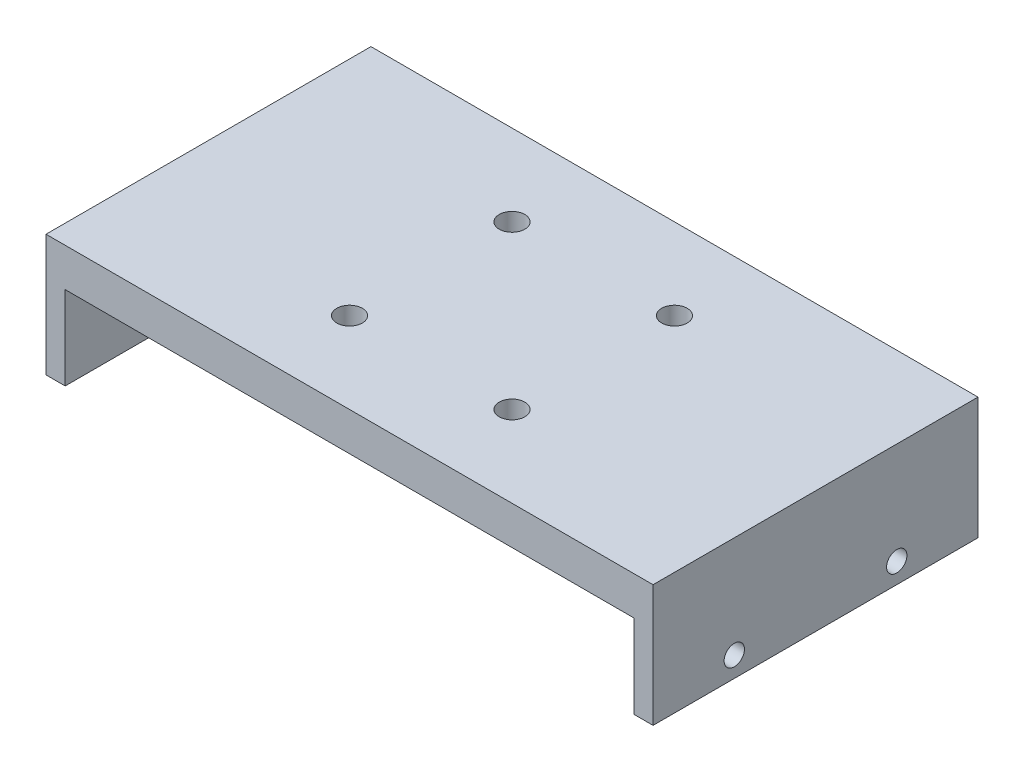
ISO-10303-21;
HEADER;
FILE_DESCRIPTION(('STEP AP214'),'2;1');
FILE_NAME('part.step','',(''),(''),'','','');
FILE_SCHEMA(('AUTOMOTIVE_DESIGN { 1 0 10303 214 1 1 1 1 }'));
ENDSEC;
DATA;
#1=APPLICATION_CONTEXT('core data for automotive mechanical design processes');
#2=APPLICATION_PROTOCOL_DEFINITION('international standard','automotive_design',2000,#1);
#3=PRODUCT_CONTEXT('',#1,'mechanical');
#4=PRODUCT('Part','Part','',(#3));
#5=PRODUCT_RELATED_PRODUCT_CATEGORY('part','',(#4));
#6=PRODUCT_DEFINITION_FORMATION('','',#4);
#7=PRODUCT_DEFINITION_CONTEXT('part definition',#1,'design');
#8=PRODUCT_DEFINITION('design','',#6,#7);
#9=PRODUCT_DEFINITION_SHAPE('','',#8);
#10=(LENGTH_UNIT() NAMED_UNIT(*) SI_UNIT(.MILLI.,.METRE.));
#11=(NAMED_UNIT(*) PLANE_ANGLE_UNIT() SI_UNIT($,.RADIAN.));
#12=(NAMED_UNIT(*) SI_UNIT($,.STERADIAN.) SOLID_ANGLE_UNIT());
#13=UNCERTAINTY_MEASURE_WITH_UNIT(LENGTH_MEASURE(1.E-05),#10,'distance_accuracy_value','');
#14=(GEOMETRIC_REPRESENTATION_CONTEXT(3) GLOBAL_UNCERTAINTY_ASSIGNED_CONTEXT((#13)) GLOBAL_UNIT_ASSIGNED_CONTEXT((#10,
#11,#12)) REPRESENTATION_CONTEXT('',''));
#15=CARTESIAN_POINT('',(0.,0.,0.));
#16=DIRECTION('',(0.,0.,1.));
#17=DIRECTION('',(1.,0.,0.));
#18=AXIS2_PLACEMENT_3D('',#15,#16,#17);
#19=CARTESIAN_POINT('',(-44.45,6.,-25.4));
#20=DIRECTION('',(0.,0.,1.));
#21=DIRECTION('',(1.,0.,0.));
#22=AXIS2_PLACEMENT_3D('',#19,#20,#21);
#23=PLANE('',#22);
#24=DIRECTION('',(-1.,0.,0.));
#25=VECTOR('',#24,1.);
#26=CARTESIAN_POINT('',(-44.45,0.,-25.4));
#27=LINE('',#26,#25);
#28=CARTESIAN_POINT('',(44.45,0.,-25.4));
#29=VERTEX_POINT('',#28);
#30=CARTESIAN_POINT('',(-44.45,0.,-25.4));
#31=VERTEX_POINT('',#30);
#32=EDGE_CURVE('E68',#29,#31,#27,.T.);
#33=ORIENTED_EDGE('',*,*,#32,.T.);
#34=DIRECTION('',(0.,-1.,0.));
#35=VECTOR('',#34,1.);
#36=CARTESIAN_POINT('',(-44.45,6.,-25.4));
#37=LINE('',#36,#35);
#38=CARTESIAN_POINT('',(-44.45,-13.05,-25.4));
#39=VERTEX_POINT('',#38);
#40=EDGE_CURVE('E176',#31,#39,#37,.T.);
#41=ORIENTED_EDGE('',*,*,#40,.T.);
#42=DIRECTION('',(1.,0.,0.));
#43=VECTOR('',#42,1.);
#44=CARTESIAN_POINT('',(-47.45,-13.05,-25.4));
#45=LINE('',#44,#43);
#46=CARTESIAN_POINT('',(-47.45,-13.05,-25.4));
#47=VERTEX_POINT('',#46);
#48=EDGE_CURVE('E201',#47,#39,#45,.T.);
#49=ORIENTED_EDGE('',*,*,#48,.F.);
#50=DIRECTION('',(0.,-1.,0.));
#51=VECTOR('',#50,1.);
#52=CARTESIAN_POINT('',(-47.45,6.,-25.4));
#53=LINE('',#52,#51);
#54=CARTESIAN_POINT('',(-47.45,6.,-25.4));
#55=VERTEX_POINT('',#54);
#56=EDGE_CURVE('E115',#55,#47,#53,.T.);
#57=ORIENTED_EDGE('',*,*,#56,.F.);
#58=DIRECTION('',(-1.,0.,0.));
#59=VECTOR('',#58,1.);
#60=CARTESIAN_POINT('',(-44.45,6.,-25.4));
#61=LINE('',#60,#59);
#62=CARTESIAN_POINT('',(47.45,6.,-25.4));
#63=VERTEX_POINT('',#62);
#64=EDGE_CURVE('E52',#63,#55,#61,.T.);
#65=ORIENTED_EDGE('',*,*,#64,.F.);
#66=DIRECTION('',(0.,-1.,0.));
#67=VECTOR('',#66,1.);
#68=CARTESIAN_POINT('',(47.45,6.,-25.4));
#69=LINE('',#68,#67);
#70=CARTESIAN_POINT('',(47.45,-13.05,-25.4));
#71=VERTEX_POINT('',#70);
#72=EDGE_CURVE('E111',#63,#71,#69,.T.);
#73=ORIENTED_EDGE('',*,*,#72,.T.);
#74=DIRECTION('',(-1.,0.,0.));
#75=VECTOR('',#74,1.);
#76=CARTESIAN_POINT('',(47.45,-13.05,-25.4));
#77=LINE('',#76,#75);
#78=CARTESIAN_POINT('',(44.45,-13.05,-25.4));
#79=VERTEX_POINT('',#78);
#80=EDGE_CURVE('E143',#71,#79,#77,.T.);
#81=ORIENTED_EDGE('',*,*,#80,.T.);
#82=DIRECTION('',(0.,-1.,0.));
#83=VECTOR('',#82,1.);
#84=CARTESIAN_POINT('',(44.45,6.,-25.4));
#85=LINE('',#84,#83);
#86=EDGE_CURVE('E144',#29,#79,#85,.T.);
#87=ORIENTED_EDGE('',*,*,#86,.F.);
#88=EDGE_LOOP('',(#33,#41,#49,#57,#65,#73,#81,#87));
#89=FACE_BOUND('',#88,.T.);
#90=ADVANCED_FACE('F43',(#89),#23,.F.);
#91=CARTESIAN_POINT('',(-44.45,6.,25.4));
#92=DIRECTION('',(0.,0.,-1.));
#93=DIRECTION('',(-1.,0.,0.));
#94=AXIS2_PLACEMENT_3D('',#91,#92,#93);
#95=PLANE('',#94);
#96=DIRECTION('',(1.,0.,0.));
#97=VECTOR('',#96,1.);
#98=CARTESIAN_POINT('',(-44.45,0.,25.4));
#99=LINE('',#98,#97);
#100=CARTESIAN_POINT('',(-44.45,0.,25.4));
#101=VERTEX_POINT('',#100);
#102=CARTESIAN_POINT('',(44.45,0.,25.4));
#103=VERTEX_POINT('',#102);
#104=EDGE_CURVE('E60',#101,#103,#99,.T.);
#105=ORIENTED_EDGE('',*,*,#104,.T.);
#106=DIRECTION('',(0.,1.,0.));
#107=VECTOR('',#106,1.);
#108=CARTESIAN_POINT('',(44.45,6.,25.4));
#109=LINE('',#108,#107);
#110=CARTESIAN_POINT('',(44.45,-13.05,25.4));
#111=VERTEX_POINT('',#110);
#112=EDGE_CURVE('E147',#111,#103,#109,.T.);
#113=ORIENTED_EDGE('',*,*,#112,.F.);
#114=DIRECTION('',(-1.,0.,0.));
#115=VECTOR('',#114,1.);
#116=CARTESIAN_POINT('',(47.45,-13.05,25.4));
#117=LINE('',#116,#115);
#118=CARTESIAN_POINT('',(47.45,-13.05,25.4));
#119=VERTEX_POINT('',#118);
#120=EDGE_CURVE('E157',#119,#111,#117,.T.);
#121=ORIENTED_EDGE('',*,*,#120,.F.);
#122=DIRECTION('',(0.,1.,0.));
#123=VECTOR('',#122,1.);
#124=CARTESIAN_POINT('',(47.45,6.,25.4));
#125=LINE('',#124,#123);
#126=CARTESIAN_POINT('',(47.45,6.,25.4));
#127=VERTEX_POINT('',#126);
#128=EDGE_CURVE('E135',#119,#127,#125,.T.);
#129=ORIENTED_EDGE('',*,*,#128,.T.);
#130=DIRECTION('',(1.,0.,0.));
#131=VECTOR('',#130,1.);
#132=CARTESIAN_POINT('',(-44.45,6.,25.4));
#133=LINE('',#132,#131);
#134=CARTESIAN_POINT('',(-47.45,6.,25.4));
#135=VERTEX_POINT('',#134);
#136=EDGE_CURVE('E11',#135,#127,#133,.T.);
#137=ORIENTED_EDGE('',*,*,#136,.F.);
#138=DIRECTION('',(0.,1.,0.));
#139=VECTOR('',#138,1.);
#140=CARTESIAN_POINT('',(-47.45,6.,25.4));
#141=LINE('',#140,#139);
#142=CARTESIAN_POINT('',(-47.45,-13.05,25.4));
#143=VERTEX_POINT('',#142);
#144=EDGE_CURVE('E183',#143,#135,#141,.T.);
#145=ORIENTED_EDGE('',*,*,#144,.F.);
#146=DIRECTION('',(1.,0.,0.));
#147=VECTOR('',#146,1.);
#148=CARTESIAN_POINT('',(-47.45,-13.05,25.4));
#149=LINE('',#148,#147);
#150=CARTESIAN_POINT('',(-44.45,-13.05,25.4));
#151=VERTEX_POINT('',#150);
#152=EDGE_CURVE('E190',#143,#151,#149,.T.);
#153=ORIENTED_EDGE('',*,*,#152,.T.);
#154=DIRECTION('',(0.,1.,0.));
#155=VECTOR('',#154,1.);
#156=CARTESIAN_POINT('',(-44.45,6.,25.4));
#157=LINE('',#156,#155);
#158=EDGE_CURVE('E180',#151,#101,#157,.T.);
#159=ORIENTED_EDGE('',*,*,#158,.T.);
#160=EDGE_LOOP('',(#105,#113,#121,#129,#137,#145,#153,#159));
#161=FACE_BOUND('',#160,.T.);
#162=ADVANCED_FACE('F264',(#161),#95,.F.);
#163=CARTESIAN_POINT('',(0.,6.,0.));
#164=DIRECTION('',(0.,-1.,0.));
#165=DIRECTION('',(0.,0.,-1.));
#166=AXIS2_PLACEMENT_3D('',#163,#164,#165);
#167=PLANE('',#166);
#168=CARTESIAN_POINT('',(12.7,6.,-12.7));
#169=DIRECTION('',(0.,1.,0.));
#170=DIRECTION('',(0.,0.,1.));
#171=AXIS2_PLACEMENT_3D('',#168,#169,#170);
#172=CIRCLE('',#171,2.);
#173=CARTESIAN_POINT('',(12.7,6.,-10.7));
#174=VERTEX_POINT('',#173);
#175=EDGE_CURVE('E501',#174,#174,#172,.T.);
#176=ORIENTED_EDGE('',*,*,#175,.F.);
#177=EDGE_LOOP('',(#176));
#178=FACE_BOUND('',#177,.T.);
#179=CARTESIAN_POINT('',(-12.7,6.,12.7));
#180=DIRECTION('',(0.,1.,0.));
#181=DIRECTION('',(0.,0.,1.));
#182=AXIS2_PLACEMENT_3D('',#179,#180,#181);
#183=CIRCLE('',#182,2.);
#184=CARTESIAN_POINT('',(-12.7,6.,14.7));
#185=VERTEX_POINT('',#184);
#186=EDGE_CURVE('E503',#185,#185,#183,.T.);
#187=ORIENTED_EDGE('',*,*,#186,.F.);
#188=EDGE_LOOP('',(#187));
#189=FACE_BOUND('',#188,.T.);
#190=CARTESIAN_POINT('',(12.7,6.,12.7));
#191=DIRECTION('',(0.,1.,0.));
#192=DIRECTION('',(0.,0.,1.));
#193=AXIS2_PLACEMENT_3D('',#190,#191,#192);
#194=CIRCLE('',#193,2.);
#195=CARTESIAN_POINT('',(12.7,6.,14.7));
#196=VERTEX_POINT('',#195);
#197=EDGE_CURVE('E509',#196,#196,#194,.T.);
#198=ORIENTED_EDGE('',*,*,#197,.F.);
#199=EDGE_LOOP('',(#198));
#200=FACE_BOUND('',#199,.T.);
#201=CARTESIAN_POINT('',(-12.7,6.,-12.7));
#202=DIRECTION('',(0.,1.,0.));
#203=DIRECTION('',(0.,0.,1.));
#204=AXIS2_PLACEMENT_3D('',#201,#202,#203);
#205=CIRCLE('',#204,2.);
#206=CARTESIAN_POINT('',(-12.7,6.,-10.7));
#207=VERTEX_POINT('',#206);
#208=EDGE_CURVE('E222',#207,#207,#205,.T.);
#209=ORIENTED_EDGE('',*,*,#208,.F.);
#210=EDGE_LOOP('',(#209));
#211=FACE_BOUND('',#210,.T.);
#212=ORIENTED_EDGE('',*,*,#136,.T.);
#213=DIRECTION('',(0.,0.,-1.));
#214=VECTOR('',#213,1.);
#215=CARTESIAN_POINT('',(47.45,6.,-25.4));
#216=LINE('',#215,#214);
#217=EDGE_CURVE('E126',#127,#63,#216,.T.);
#218=ORIENTED_EDGE('',*,*,#217,.T.);
#219=ORIENTED_EDGE('',*,*,#64,.T.);
#220=DIRECTION('',(0.,0.,-1.));
#221=VECTOR('',#220,1.);
#222=CARTESIAN_POINT('',(-47.45,6.,-25.4));
#223=LINE('',#222,#221);
#224=EDGE_CURVE('E187',#135,#55,#223,.T.);
#225=ORIENTED_EDGE('',*,*,#224,.F.);
#226=EDGE_LOOP('',(#212,#218,#219,#225));
#227=FACE_BOUND('',#226,.T.);
#228=ADVANCED_FACE('F133',(#178,#189,#200,#211,#227),#167,.F.);
#229=CARTESIAN_POINT('',(0.,0.,0.));
#230=DIRECTION('',(0.,-1.,0.));
#231=DIRECTION('',(0.,0.,-1.));
#232=AXIS2_PLACEMENT_3D('',#229,#230,#231);
#233=PLANE('',#232);
#234=CARTESIAN_POINT('',(12.7,0.,-12.7));
#235=DIRECTION('',(0.,-1.,0.));
#236=DIRECTION('',(0.,0.,-1.));
#237=AXIS2_PLACEMENT_3D('',#234,#235,#236);
#238=CIRCLE('',#237,2.);
#239=CARTESIAN_POINT('',(12.7,0.,-10.7));
#240=VERTEX_POINT('',#239);
#241=EDGE_CURVE('E46',#240,#240,#238,.T.);
#242=ORIENTED_EDGE('',*,*,#241,.F.);
#243=EDGE_LOOP('',(#242));
#244=FACE_BOUND('',#243,.T.);
#245=CARTESIAN_POINT('',(-12.7,0.,12.7));
#246=DIRECTION('',(0.,-1.,0.));
#247=DIRECTION('',(0.,0.,-1.));
#248=AXIS2_PLACEMENT_3D('',#245,#246,#247);
#249=CIRCLE('',#248,2.);
#250=CARTESIAN_POINT('',(-12.7,0.,14.7));
#251=VERTEX_POINT('',#250);
#252=EDGE_CURVE('E225',#251,#251,#249,.T.);
#253=ORIENTED_EDGE('',*,*,#252,.F.);
#254=EDGE_LOOP('',(#253));
#255=FACE_BOUND('',#254,.T.);
#256=CARTESIAN_POINT('',(12.7,0.,12.7));
#257=DIRECTION('',(0.,-1.,0.));
#258=DIRECTION('',(0.,0.,-1.));
#259=AXIS2_PLACEMENT_3D('',#256,#257,#258);
#260=CIRCLE('',#259,2.);
#261=CARTESIAN_POINT('',(12.7,0.,14.7));
#262=VERTEX_POINT('',#261);
#263=EDGE_CURVE('E221',#262,#262,#260,.T.);
#264=ORIENTED_EDGE('',*,*,#263,.F.);
#265=EDGE_LOOP('',(#264));
#266=FACE_BOUND('',#265,.T.);
#267=CARTESIAN_POINT('',(-12.7,0.,-12.7));
#268=DIRECTION('',(0.,-1.,0.));
#269=DIRECTION('',(0.,0.,-1.));
#270=AXIS2_PLACEMENT_3D('',#267,#268,#269);
#271=CIRCLE('',#270,2.);
#272=CARTESIAN_POINT('',(-12.7,0.,-10.7));
#273=VERTEX_POINT('',#272);
#274=EDGE_CURVE('E217',#273,#273,#271,.T.);
#275=ORIENTED_EDGE('',*,*,#274,.F.);
#276=EDGE_LOOP('',(#275));
#277=FACE_BOUND('',#276,.T.);
#278=DIRECTION('',(0.,0.,-1.));
#279=VECTOR('',#278,1.);
#280=CARTESIAN_POINT('',(44.45,0.,25.4));
#281=LINE('',#280,#279);
#282=EDGE_CURVE('E204',#103,#29,#281,.T.);
#283=ORIENTED_EDGE('',*,*,#282,.F.);
#284=ORIENTED_EDGE('',*,*,#104,.F.);
#285=DIRECTION('',(0.,0.,1.));
#286=VECTOR('',#285,1.);
#287=CARTESIAN_POINT('',(-44.45,0.,25.4));
#288=LINE('',#287,#286);
#289=EDGE_CURVE('E211',#31,#101,#288,.T.);
#290=ORIENTED_EDGE('',*,*,#289,.F.);
#291=ORIENTED_EDGE('',*,*,#32,.F.);
#292=EDGE_LOOP('',(#283,#284,#290,#291));
#293=FACE_BOUND('',#292,.T.);
#294=ADVANCED_FACE('F282',(#244,#255,#266,#277,#293),#233,.T.);
#295=CARTESIAN_POINT('',(-44.45,0.,0.));
#296=DIRECTION('',(-1.,0.,0.));
#297=DIRECTION('',(0.,0.,1.));
#298=AXIS2_PLACEMENT_3D('',#295,#296,#297);
#299=PLANE('',#298);
#300=CARTESIAN_POINT('',(-44.45,-9.875,-12.7));
#301=DIRECTION('',(-1.,0.,0.));
#302=DIRECTION('',(0.,0.,1.));
#303=AXIS2_PLACEMENT_3D('',#300,#301,#302);
#304=CIRCLE('',#303,1.5875);
#305=CARTESIAN_POINT('',(-44.45,-9.875,-11.1125));
#306=VERTEX_POINT('',#305);
#307=EDGE_CURVE('E172',#306,#306,#304,.T.);
#308=ORIENTED_EDGE('',*,*,#307,.T.);
#309=EDGE_LOOP('',(#308));
#310=FACE_BOUND('',#309,.T.);
#311=CARTESIAN_POINT('',(-44.45,-9.875,12.7));
#312=DIRECTION('',(-1.,0.,0.));
#313=DIRECTION('',(0.,0.,1.));
#314=AXIS2_PLACEMENT_3D('',#311,#312,#313);
#315=CIRCLE('',#314,1.5875);
#316=CARTESIAN_POINT('',(-44.45,-9.875,14.2875));
#317=VERTEX_POINT('',#316);
#318=EDGE_CURVE('E165',#317,#317,#315,.T.);
#319=ORIENTED_EDGE('',*,*,#318,.T.);
#320=EDGE_LOOP('',(#319));
#321=FACE_BOUND('',#320,.T.);
#322=ORIENTED_EDGE('',*,*,#40,.F.);
#323=ORIENTED_EDGE('',*,*,#289,.T.);
#324=ORIENTED_EDGE('',*,*,#158,.F.);
#325=DIRECTION('',(0.,0.,1.));
#326=VECTOR('',#325,1.);
#327=CARTESIAN_POINT('',(-44.45,-13.05,-25.4));
#328=LINE('',#327,#326);
#329=EDGE_CURVE('E193',#39,#151,#328,.T.);
#330=ORIENTED_EDGE('',*,*,#329,.F.);
#331=EDGE_LOOP('',(#322,#323,#324,#330));
#332=FACE_BOUND('',#331,.T.);
#333=ADVANCED_FACE('F287',(#310,#321,#332),#299,.F.);
#334=CARTESIAN_POINT('',(-47.45,-13.05,-25.4));
#335=DIRECTION('',(0.,1.,0.));
#336=DIRECTION('',(0.,0.,1.));
#337=AXIS2_PLACEMENT_3D('',#334,#335,#336);
#338=PLANE('',#337);
#339=ORIENTED_EDGE('',*,*,#329,.T.);
#340=ORIENTED_EDGE('',*,*,#152,.F.);
#341=DIRECTION('',(0.,0.,1.));
#342=VECTOR('',#341,1.);
#343=CARTESIAN_POINT('',(-47.45,-13.05,-25.4));
#344=LINE('',#343,#342);
#345=EDGE_CURVE('E179',#47,#143,#344,.T.);
#346=ORIENTED_EDGE('',*,*,#345,.F.);
#347=ORIENTED_EDGE('',*,*,#48,.T.);
#348=EDGE_LOOP('',(#339,#340,#346,#347));
#349=FACE_BOUND('',#348,.T.);
#350=ADVANCED_FACE('F290',(#349),#338,.F.);
#351=CARTESIAN_POINT('',(-47.45,0.,0.));
#352=DIRECTION('',(-1.,0.,0.));
#353=DIRECTION('',(0.,0.,1.));
#354=AXIS2_PLACEMENT_3D('',#351,#352,#353);
#355=PLANE('',#354);
#356=CARTESIAN_POINT('',(-47.45,-9.875,-12.7));
#357=DIRECTION('',(-1.,0.,0.));
#358=DIRECTION('',(0.,0.,1.));
#359=AXIS2_PLACEMENT_3D('',#356,#357,#358);
#360=CIRCLE('',#359,1.5875);
#361=CARTESIAN_POINT('',(-47.45,-9.875,-11.1125));
#362=VERTEX_POINT('',#361);
#363=EDGE_CURVE('E161',#362,#362,#360,.T.);
#364=ORIENTED_EDGE('',*,*,#363,.F.);
#365=EDGE_LOOP('',(#364));
#366=FACE_BOUND('',#365,.T.);
#367=CARTESIAN_POINT('',(-47.45,-9.875,12.7));
#368=DIRECTION('',(-1.,0.,0.));
#369=DIRECTION('',(0.,0.,1.));
#370=AXIS2_PLACEMENT_3D('',#367,#368,#369);
#371=CIRCLE('',#370,1.5875);
#372=CARTESIAN_POINT('',(-47.45,-9.875,14.2875));
#373=VERTEX_POINT('',#372);
#374=EDGE_CURVE('E160',#373,#373,#371,.T.);
#375=ORIENTED_EDGE('',*,*,#374,.F.);
#376=EDGE_LOOP('',(#375));
#377=FACE_BOUND('',#376,.T.);
#378=ORIENTED_EDGE('',*,*,#56,.T.);
#379=ORIENTED_EDGE('',*,*,#345,.T.);
#380=ORIENTED_EDGE('',*,*,#144,.T.);
#381=ORIENTED_EDGE('',*,*,#224,.T.);
#382=EDGE_LOOP('',(#378,#379,#380,#381));
#383=FACE_BOUND('',#382,.T.);
#384=ADVANCED_FACE('F293',(#366,#377,#383),#355,.T.);
#385=CARTESIAN_POINT('',(44.45,-9.875,12.7));
#386=DIRECTION('',(-1.,0.,0.));
#387=DIRECTION('',(0.,0.,1.));
#388=AXIS2_PLACEMENT_3D('',#385,#386,#387);
#389=CYLINDRICAL_SURFACE('',#388,1.5875);
#390=ORIENTED_EDGE('',*,*,#374,.T.);
#391=EDGE_LOOP('',(#390));
#392=FACE_BOUND('',#391,.T.);
#393=ORIENTED_EDGE('',*,*,#318,.F.);
#394=EDGE_LOOP('',(#393));
#395=FACE_BOUND('',#394,.T.);
#396=ADVANCED_FACE('F300',(#392,#395),#389,.F.);
#397=CARTESIAN_POINT('',(44.45,-9.875,-12.7));
#398=DIRECTION('',(-1.,0.,0.));
#399=DIRECTION('',(0.,0.,1.));
#400=AXIS2_PLACEMENT_3D('',#397,#398,#399);
#401=CYLINDRICAL_SURFACE('',#400,1.5875);
#402=ORIENTED_EDGE('',*,*,#363,.T.);
#403=EDGE_LOOP('',(#402));
#404=FACE_BOUND('',#403,.T.);
#405=ORIENTED_EDGE('',*,*,#307,.F.);
#406=EDGE_LOOP('',(#405));
#407=FACE_BOUND('',#406,.T.);
#408=ADVANCED_FACE('F259',(#404,#407),#401,.F.);
#409=CARTESIAN_POINT('',(44.45,0.,0.));
#410=DIRECTION('',(1.,0.,0.));
#411=DIRECTION('',(0.,0.,1.));
#412=AXIS2_PLACEMENT_3D('',#409,#410,#411);
#413=PLANE('',#412);
#414=CARTESIAN_POINT('',(44.45,-9.875,-12.7));
#415=DIRECTION('',(1.,0.,0.));
#416=DIRECTION('',(0.,0.,-1.));
#417=AXIS2_PLACEMENT_3D('',#414,#415,#416);
#418=CIRCLE('',#417,1.5875);
#419=CARTESIAN_POINT('',(44.45,-9.875,-14.2875));
#420=VERTEX_POINT('',#419);
#421=EDGE_CURVE('E148',#420,#420,#418,.F.);
#422=ORIENTED_EDGE('',*,*,#421,.F.);
#423=EDGE_LOOP('',(#422));
#424=FACE_BOUND('',#423,.T.);
#425=CARTESIAN_POINT('',(44.45,-9.875,12.7));
#426=DIRECTION('',(1.,0.,0.));
#427=DIRECTION('',(0.,0.,-1.));
#428=AXIS2_PLACEMENT_3D('',#425,#426,#427);
#429=CIRCLE('',#428,1.5875);
#430=CARTESIAN_POINT('',(44.45,-9.875,11.1125));
#431=VERTEX_POINT('',#430);
#432=EDGE_CURVE('E243',#431,#431,#429,.F.);
#433=ORIENTED_EDGE('',*,*,#432,.F.);
#434=EDGE_LOOP('',(#433));
#435=FACE_BOUND('',#434,.T.);
#436=ORIENTED_EDGE('',*,*,#112,.T.);
#437=ORIENTED_EDGE('',*,*,#282,.T.);
#438=ORIENTED_EDGE('',*,*,#86,.T.);
#439=DIRECTION('',(0.,0.,1.));
#440=VECTOR('',#439,1.);
#441=CARTESIAN_POINT('',(44.45,-13.05,-25.4));
#442=LINE('',#441,#440);
#443=EDGE_CURVE('E131',#79,#111,#442,.T.);
#444=ORIENTED_EDGE('',*,*,#443,.T.);
#445=EDGE_LOOP('',(#436,#437,#438,#444));
#446=FACE_BOUND('',#445,.T.);
#447=ADVANCED_FACE('F255',(#424,#435,#446),#413,.F.);
#448=CARTESIAN_POINT('',(47.45,-13.05,-25.4));
#449=DIRECTION('',(0.,-1.,0.));
#450=DIRECTION('',(0.,0.,-1.));
#451=AXIS2_PLACEMENT_3D('',#448,#449,#450);
#452=PLANE('',#451);
#453=ORIENTED_EDGE('',*,*,#443,.F.);
#454=ORIENTED_EDGE('',*,*,#80,.F.);
#455=DIRECTION('',(0.,0.,1.));
#456=VECTOR('',#455,1.);
#457=CARTESIAN_POINT('',(47.45,-13.05,-25.4));
#458=LINE('',#457,#456);
#459=EDGE_CURVE('E129',#71,#119,#458,.T.);
#460=ORIENTED_EDGE('',*,*,#459,.T.);
#461=ORIENTED_EDGE('',*,*,#120,.T.);
#462=EDGE_LOOP('',(#453,#454,#460,#461));
#463=FACE_BOUND('',#462,.T.);
#464=ADVANCED_FACE('F258',(#463),#452,.T.);
#465=CARTESIAN_POINT('',(47.45,0.,0.));
#466=DIRECTION('',(1.,0.,0.));
#467=DIRECTION('',(0.,0.,1.));
#468=AXIS2_PLACEMENT_3D('',#465,#466,#467);
#469=PLANE('',#468);
#470=CARTESIAN_POINT('',(47.45,-9.875,-12.7));
#471=DIRECTION('',(-1.,0.,0.));
#472=DIRECTION('',(0.,0.,1.));
#473=AXIS2_PLACEMENT_3D('',#470,#471,#472);
#474=CIRCLE('',#473,1.5875);
#475=CARTESIAN_POINT('',(47.45,-9.875,-11.1125));
#476=VERTEX_POINT('',#475);
#477=EDGE_CURVE('E237',#476,#476,#474,.T.);
#478=ORIENTED_EDGE('',*,*,#477,.T.);
#479=EDGE_LOOP('',(#478));
#480=FACE_BOUND('',#479,.T.);
#481=CARTESIAN_POINT('',(47.45,-9.875,12.7));
#482=DIRECTION('',(-1.,0.,0.));
#483=DIRECTION('',(0.,0.,1.));
#484=AXIS2_PLACEMENT_3D('',#481,#482,#483);
#485=CIRCLE('',#484,1.5875);
#486=CARTESIAN_POINT('',(47.45,-9.875,14.2875));
#487=VERTEX_POINT('',#486);
#488=EDGE_CURVE('E232',#487,#487,#485,.T.);
#489=ORIENTED_EDGE('',*,*,#488,.T.);
#490=EDGE_LOOP('',(#489));
#491=FACE_BOUND('',#490,.T.);
#492=ORIENTED_EDGE('',*,*,#72,.F.);
#493=ORIENTED_EDGE('',*,*,#217,.F.);
#494=ORIENTED_EDGE('',*,*,#128,.F.);
#495=ORIENTED_EDGE('',*,*,#459,.F.);
#496=EDGE_LOOP('',(#492,#493,#494,#495));
#497=FACE_BOUND('',#496,.T.);
#498=ADVANCED_FACE('F124',(#480,#491,#497),#469,.T.);
#499=CARTESIAN_POINT('',(-47.45,-9.875,12.7));
#500=DIRECTION('',(1.,0.,0.));
#501=DIRECTION('',(0.,0.,-1.));
#502=AXIS2_PLACEMENT_3D('',#499,#500,#501);
#503=CYLINDRICAL_SURFACE('',#502,1.5875);
#504=ORIENTED_EDGE('',*,*,#488,.F.);
#505=EDGE_LOOP('',(#504));
#506=FACE_BOUND('',#505,.T.);
#507=ORIENTED_EDGE('',*,*,#432,.T.);
#508=EDGE_LOOP('',(#507));
#509=FACE_BOUND('',#508,.T.);
#510=ADVANCED_FACE('F271',(#506,#509),#503,.F.);
#511=CARTESIAN_POINT('',(-47.45,-9.875,-12.7));
#512=DIRECTION('',(1.,0.,0.));
#513=DIRECTION('',(0.,0.,-1.));
#514=AXIS2_PLACEMENT_3D('',#511,#512,#513);
#515=CYLINDRICAL_SURFACE('',#514,1.5875);
#516=ORIENTED_EDGE('',*,*,#477,.F.);
#517=EDGE_LOOP('',(#516));
#518=FACE_BOUND('',#517,.T.);
#519=ORIENTED_EDGE('',*,*,#421,.T.);
#520=EDGE_LOOP('',(#519));
#521=FACE_BOUND('',#520,.T.);
#522=ADVANCED_FACE('F253',(#518,#521),#515,.F.);
#523=CARTESIAN_POINT('',(-12.7,-13.05,-12.7));
#524=DIRECTION('',(0.,1.,0.));
#525=DIRECTION('',(0.,0.,1.));
#526=AXIS2_PLACEMENT_3D('',#523,#524,#525);
#527=CYLINDRICAL_SURFACE('',#526,2.);
#528=CARTESIAN_POINT('',(-12.7,0.,-10.7));
#529=CARTESIAN_POINT('',(-12.7,0.0625000000000001,-10.7));
#530=CARTESIAN_POINT('',(-12.7,0.125,-10.7));
#531=CARTESIAN_POINT('',(-12.7,0.25,-10.7));
#532=CARTESIAN_POINT('',(-12.7,0.3125,-10.7));
#533=CARTESIAN_POINT('',(-12.7,0.4375,-10.7));
#534=CARTESIAN_POINT('',(-12.7,0.5,-10.7));
#535=CARTESIAN_POINT('',(-12.7,0.625000000000001,-10.7));
#536=CARTESIAN_POINT('',(-12.7,0.687500000000001,-10.7));
#537=CARTESIAN_POINT('',(-12.7,0.812500000000001,-10.7));
#538=CARTESIAN_POINT('',(-12.7,0.875000000000001,-10.7));
#539=CARTESIAN_POINT('',(-12.7,1.,-10.7));
#540=CARTESIAN_POINT('',(-12.7,1.0625,-10.7));
#541=CARTESIAN_POINT('',(-12.7,1.1875,-10.7));
#542=CARTESIAN_POINT('',(-12.7,1.25,-10.7));
#543=CARTESIAN_POINT('',(-12.7,1.375,-10.7));
#544=CARTESIAN_POINT('',(-12.7,1.4375,-10.7));
#545=CARTESIAN_POINT('',(-12.7,1.5625,-10.7));
#546=CARTESIAN_POINT('',(-12.7,1.625,-10.7));
#547=CARTESIAN_POINT('',(-12.7,1.75,-10.7));
#548=CARTESIAN_POINT('',(-12.7,1.8125,-10.7));
#549=CARTESIAN_POINT('',(-12.7,1.9375,-10.7));
#550=CARTESIAN_POINT('',(-12.7,2.,-10.7));
#551=CARTESIAN_POINT('',(-12.7,2.125,-10.7));
#552=CARTESIAN_POINT('',(-12.7,2.1875,-10.7));
#553=CARTESIAN_POINT('',(-12.7,2.3125,-10.7));
#554=CARTESIAN_POINT('',(-12.7,2.375,-10.7));
#555=CARTESIAN_POINT('',(-12.7,2.5,-10.7));
#556=CARTESIAN_POINT('',(-12.7,2.5625,-10.7));
#557=CARTESIAN_POINT('',(-12.7,2.6875,-10.7));
#558=CARTESIAN_POINT('',(-12.7,2.75,-10.7));
#559=CARTESIAN_POINT('',(-12.7,2.875,-10.7));
#560=CARTESIAN_POINT('',(-12.7,2.9375,-10.7));
#561=CARTESIAN_POINT('',(-12.7,3.0625,-10.7));
#562=CARTESIAN_POINT('',(-12.7,3.125,-10.7));
#563=CARTESIAN_POINT('',(-12.7,3.25,-10.7));
#564=CARTESIAN_POINT('',(-12.7,3.3125,-10.7));
#565=CARTESIAN_POINT('',(-12.7,3.4375,-10.7));
#566=CARTESIAN_POINT('',(-12.7,3.5,-10.7));
#567=CARTESIAN_POINT('',(-12.7,3.625,-10.7));
#568=CARTESIAN_POINT('',(-12.7,3.6875,-10.7));
#569=CARTESIAN_POINT('',(-12.7,3.8125,-10.7));
#570=CARTESIAN_POINT('',(-12.7,3.875,-10.7));
#571=CARTESIAN_POINT('',(-12.7,4.,-10.7));
#572=CARTESIAN_POINT('',(-12.7,4.0625,-10.7));
#573=CARTESIAN_POINT('',(-12.7,4.1875,-10.7));
#574=CARTESIAN_POINT('',(-12.7,4.25,-10.7));
#575=CARTESIAN_POINT('',(-12.7,4.375,-10.7));
#576=CARTESIAN_POINT('',(-12.7,4.4375,-10.7));
#577=CARTESIAN_POINT('',(-12.7,4.5625,-10.7));
#578=CARTESIAN_POINT('',(-12.7,4.625,-10.7));
#579=CARTESIAN_POINT('',(-12.7,4.75,-10.7));
#580=CARTESIAN_POINT('',(-12.7,4.8125,-10.7));
#581=CARTESIAN_POINT('',(-12.7,4.9375,-10.7));
#582=CARTESIAN_POINT('',(-12.7,5.,-10.7));
#583=CARTESIAN_POINT('',(-12.7,5.125,-10.7));
#584=CARTESIAN_POINT('',(-12.7,5.1875,-10.7));
#585=CARTESIAN_POINT('',(-12.7,5.3125,-10.7));
#586=CARTESIAN_POINT('',(-12.7,5.375,-10.7));
#587=CARTESIAN_POINT('',(-12.7,5.5,-10.7));
#588=CARTESIAN_POINT('',(-12.7,5.5625,-10.7));
#589=CARTESIAN_POINT('',(-12.7,5.6875,-10.7));
#590=CARTESIAN_POINT('',(-12.7,5.75,-10.7));
#591=CARTESIAN_POINT('',(-12.7,5.875,-10.7));
#592=CARTESIAN_POINT('',(-12.7,5.9375,-10.7));
#593=CARTESIAN_POINT('',(-12.7,6.,-10.7));
#594=B_SPLINE_CURVE_WITH_KNOTS('',3,(#528,#529,#530,#531,#532,#533,#534,#535,#536,#537,#538,
#539,#540,#541,#542,#543,#544,#545,#546,#547,#548,#549,#550,#551,#552,#553,#554,#555,#556,#557,
#558,#559,#560,#561,#562,#563,#564,#565,#566,#567,#568,#569,#570,#571,#572,#573,#574,#575,#576,
#577,#578,#579,#580,#581,#582,#583,#584,#585,#586,#587,#588,#589,#590,#591,#592,#593),
.UNSPECIFIED.,.F.,.F.,(4,2,2,2,2,2,2,2,2,2,2,2,2,2,2,2,2,2,2,2,2,2,2,2,2,2,2,2,2,2,2,2,4),(0.,
0.1875,0.375,0.5625,0.750000000000001,0.937500000000001,1.125,1.3125,1.5,1.6875,1.875,2.0625,
2.25,2.4375,2.625,2.8125,3.,3.1875,3.375,3.5625,3.75,3.9375,4.125,4.3125,4.5,4.6875,4.875,
5.0625,5.25,5.4375,5.625,5.8125,6.),.UNSPECIFIED.);
#595=EDGE_CURVE('BSEAM365',#273,#207,#594,.T.);
#596=ORIENTED_EDGE('',*,*,#274,.T.);
#597=ORIENTED_EDGE('',*,*,#208,.T.);
#598=ORIENTED_EDGE('',*,*,#595,.T.);
#599=ORIENTED_EDGE('',*,*,#595,.F.);
#600=EDGE_LOOP('',(#596,#598,#597,#599));
#601=FACE_BOUND('',#600,.T.);
#602=ADVANCED_FACE('F365',(#601),#527,.F.);
#603=CARTESIAN_POINT('',(12.7,-13.05,12.7));
#604=DIRECTION('',(0.,1.,0.));
#605=DIRECTION('',(0.,0.,1.));
#606=AXIS2_PLACEMENT_3D('',#603,#604,#605);
#607=CYLINDRICAL_SURFACE('',#606,2.);
#608=CARTESIAN_POINT('',(12.7,0.,14.7));
#609=CARTESIAN_POINT('',(12.7,0.0625000000000001,14.7));
#610=CARTESIAN_POINT('',(12.7,0.125,14.7));
#611=CARTESIAN_POINT('',(12.7,0.25,14.7));
#612=CARTESIAN_POINT('',(12.7,0.3125,14.7));
#613=CARTESIAN_POINT('',(12.7,0.4375,14.7));
#614=CARTESIAN_POINT('',(12.7,0.5,14.7));
#615=CARTESIAN_POINT('',(12.7,0.625000000000001,14.7));
#616=CARTESIAN_POINT('',(12.7,0.687500000000001,14.7));
#617=CARTESIAN_POINT('',(12.7,0.812500000000001,14.7));
#618=CARTESIAN_POINT('',(12.7,0.875000000000001,14.7));
#619=CARTESIAN_POINT('',(12.7,1.,14.7));
#620=CARTESIAN_POINT('',(12.7,1.0625,14.7));
#621=CARTESIAN_POINT('',(12.7,1.1875,14.7));
#622=CARTESIAN_POINT('',(12.7,1.25,14.7));
#623=CARTESIAN_POINT('',(12.7,1.375,14.7));
#624=CARTESIAN_POINT('',(12.7,1.4375,14.7));
#625=CARTESIAN_POINT('',(12.7,1.5625,14.7));
#626=CARTESIAN_POINT('',(12.7,1.625,14.7));
#627=CARTESIAN_POINT('',(12.7,1.75,14.7));
#628=CARTESIAN_POINT('',(12.7,1.8125,14.7));
#629=CARTESIAN_POINT('',(12.7,1.9375,14.7));
#630=CARTESIAN_POINT('',(12.7,2.,14.7));
#631=CARTESIAN_POINT('',(12.7,2.125,14.7));
#632=CARTESIAN_POINT('',(12.7,2.1875,14.7));
#633=CARTESIAN_POINT('',(12.7,2.3125,14.7));
#634=CARTESIAN_POINT('',(12.7,2.375,14.7));
#635=CARTESIAN_POINT('',(12.7,2.5,14.7));
#636=CARTESIAN_POINT('',(12.7,2.5625,14.7));
#637=CARTESIAN_POINT('',(12.7,2.6875,14.7));
#638=CARTESIAN_POINT('',(12.7,2.75,14.7));
#639=CARTESIAN_POINT('',(12.7,2.875,14.7));
#640=CARTESIAN_POINT('',(12.7,2.9375,14.7));
#641=CARTESIAN_POINT('',(12.7,3.0625,14.7));
#642=CARTESIAN_POINT('',(12.7,3.125,14.7));
#643=CARTESIAN_POINT('',(12.7,3.25,14.7));
#644=CARTESIAN_POINT('',(12.7,3.3125,14.7));
#645=CARTESIAN_POINT('',(12.7,3.4375,14.7));
#646=CARTESIAN_POINT('',(12.7,3.5,14.7));
#647=CARTESIAN_POINT('',(12.7,3.625,14.7));
#648=CARTESIAN_POINT('',(12.7,3.6875,14.7));
#649=CARTESIAN_POINT('',(12.7,3.8125,14.7));
#650=CARTESIAN_POINT('',(12.7,3.875,14.7));
#651=CARTESIAN_POINT('',(12.7,4.,14.7));
#652=CARTESIAN_POINT('',(12.7,4.0625,14.7));
#653=CARTESIAN_POINT('',(12.7,4.1875,14.7));
#654=CARTESIAN_POINT('',(12.7,4.25,14.7));
#655=CARTESIAN_POINT('',(12.7,4.375,14.7));
#656=CARTESIAN_POINT('',(12.7,4.4375,14.7));
#657=CARTESIAN_POINT('',(12.7,4.5625,14.7));
#658=CARTESIAN_POINT('',(12.7,4.625,14.7));
#659=CARTESIAN_POINT('',(12.7,4.75,14.7));
#660=CARTESIAN_POINT('',(12.7,4.8125,14.7));
#661=CARTESIAN_POINT('',(12.7,4.9375,14.7));
#662=CARTESIAN_POINT('',(12.7,5.,14.7));
#663=CARTESIAN_POINT('',(12.7,5.125,14.7));
#664=CARTESIAN_POINT('',(12.7,5.1875,14.7));
#665=CARTESIAN_POINT('',(12.7,5.3125,14.7));
#666=CARTESIAN_POINT('',(12.7,5.375,14.7));
#667=CARTESIAN_POINT('',(12.7,5.5,14.7));
#668=CARTESIAN_POINT('',(12.7,5.5625,14.7));
#669=CARTESIAN_POINT('',(12.7,5.6875,14.7));
#670=CARTESIAN_POINT('',(12.7,5.75,14.7));
#671=CARTESIAN_POINT('',(12.7,5.875,14.7));
#672=CARTESIAN_POINT('',(12.7,5.9375,14.7));
#673=CARTESIAN_POINT('',(12.7,6.,14.7));
#674=B_SPLINE_CURVE_WITH_KNOTS('',3,(#608,#609,#610,#611,#612,#613,#614,#615,#616,#617,#618,
#619,#620,#621,#622,#623,#624,#625,#626,#627,#628,#629,#630,#631,#632,#633,#634,#635,#636,#637,
#638,#639,#640,#641,#642,#643,#644,#645,#646,#647,#648,#649,#650,#651,#652,#653,#654,#655,#656,
#657,#658,#659,#660,#661,#662,#663,#664,#665,#666,#667,#668,#669,#670,#671,#672,#673),
.UNSPECIFIED.,.F.,.F.,(4,2,2,2,2,2,2,2,2,2,2,2,2,2,2,2,2,2,2,2,2,2,2,2,2,2,2,2,2,2,2,2,4),(0.,
0.1875,0.375,0.5625,0.750000000000001,0.937500000000001,1.125,1.3125,1.5,1.6875,1.875,2.0625,
2.25,2.4375,2.625,2.8125,3.,3.1875,3.375,3.5625,3.75,3.9375,4.125,4.3125,4.5,4.6875,4.875,
5.0625,5.25,5.4375,5.625,5.8125,6.),.UNSPECIFIED.);
#675=EDGE_CURVE('BSEAM391',#262,#196,#674,.T.);
#676=ORIENTED_EDGE('',*,*,#263,.T.);
#677=ORIENTED_EDGE('',*,*,#197,.T.);
#678=ORIENTED_EDGE('',*,*,#675,.T.);
#679=ORIENTED_EDGE('',*,*,#675,.F.);
#680=EDGE_LOOP('',(#676,#678,#677,#679));
#681=FACE_BOUND('',#680,.T.);
#682=ADVANCED_FACE('F391',(#681),#607,.F.);
#683=CARTESIAN_POINT('',(-12.7,-13.05,12.7));
#684=DIRECTION('',(0.,1.,0.));
#685=DIRECTION('',(0.,0.,1.));
#686=AXIS2_PLACEMENT_3D('',#683,#684,#685);
#687=CYLINDRICAL_SURFACE('',#686,2.);
#688=CARTESIAN_POINT('',(-12.7,0.,14.7));
#689=CARTESIAN_POINT('',(-12.7,0.0625000000000001,14.7));
#690=CARTESIAN_POINT('',(-12.7,0.125,14.7));
#691=CARTESIAN_POINT('',(-12.7,0.25,14.7));
#692=CARTESIAN_POINT('',(-12.7,0.3125,14.7));
#693=CARTESIAN_POINT('',(-12.7,0.4375,14.7));
#694=CARTESIAN_POINT('',(-12.7,0.5,14.7));
#695=CARTESIAN_POINT('',(-12.7,0.625000000000001,14.7));
#696=CARTESIAN_POINT('',(-12.7,0.687500000000001,14.7));
#697=CARTESIAN_POINT('',(-12.7,0.812500000000001,14.7));
#698=CARTESIAN_POINT('',(-12.7,0.875000000000001,14.7));
#699=CARTESIAN_POINT('',(-12.7,1.,14.7));
#700=CARTESIAN_POINT('',(-12.7,1.0625,14.7));
#701=CARTESIAN_POINT('',(-12.7,1.1875,14.7));
#702=CARTESIAN_POINT('',(-12.7,1.25,14.7));
#703=CARTESIAN_POINT('',(-12.7,1.375,14.7));
#704=CARTESIAN_POINT('',(-12.7,1.4375,14.7));
#705=CARTESIAN_POINT('',(-12.7,1.5625,14.7));
#706=CARTESIAN_POINT('',(-12.7,1.625,14.7));
#707=CARTESIAN_POINT('',(-12.7,1.75,14.7));
#708=CARTESIAN_POINT('',(-12.7,1.8125,14.7));
#709=CARTESIAN_POINT('',(-12.7,1.9375,14.7));
#710=CARTESIAN_POINT('',(-12.7,2.,14.7));
#711=CARTESIAN_POINT('',(-12.7,2.125,14.7));
#712=CARTESIAN_POINT('',(-12.7,2.1875,14.7));
#713=CARTESIAN_POINT('',(-12.7,2.3125,14.7));
#714=CARTESIAN_POINT('',(-12.7,2.375,14.7));
#715=CARTESIAN_POINT('',(-12.7,2.5,14.7));
#716=CARTESIAN_POINT('',(-12.7,2.5625,14.7));
#717=CARTESIAN_POINT('',(-12.7,2.6875,14.7));
#718=CARTESIAN_POINT('',(-12.7,2.75,14.7));
#719=CARTESIAN_POINT('',(-12.7,2.875,14.7));
#720=CARTESIAN_POINT('',(-12.7,2.9375,14.7));
#721=CARTESIAN_POINT('',(-12.7,3.0625,14.7));
#722=CARTESIAN_POINT('',(-12.7,3.125,14.7));
#723=CARTESIAN_POINT('',(-12.7,3.25,14.7));
#724=CARTESIAN_POINT('',(-12.7,3.3125,14.7));
#725=CARTESIAN_POINT('',(-12.7,3.4375,14.7));
#726=CARTESIAN_POINT('',(-12.7,3.5,14.7));
#727=CARTESIAN_POINT('',(-12.7,3.625,14.7));
#728=CARTESIAN_POINT('',(-12.7,3.6875,14.7));
#729=CARTESIAN_POINT('',(-12.7,3.8125,14.7));
#730=CARTESIAN_POINT('',(-12.7,3.875,14.7));
#731=CARTESIAN_POINT('',(-12.7,4.,14.7));
#732=CARTESIAN_POINT('',(-12.7,4.0625,14.7));
#733=CARTESIAN_POINT('',(-12.7,4.1875,14.7));
#734=CARTESIAN_POINT('',(-12.7,4.25,14.7));
#735=CARTESIAN_POINT('',(-12.7,4.375,14.7));
#736=CARTESIAN_POINT('',(-12.7,4.4375,14.7));
#737=CARTESIAN_POINT('',(-12.7,4.5625,14.7));
#738=CARTESIAN_POINT('',(-12.7,4.625,14.7));
#739=CARTESIAN_POINT('',(-12.7,4.75,14.7));
#740=CARTESIAN_POINT('',(-12.7,4.8125,14.7));
#741=CARTESIAN_POINT('',(-12.7,4.9375,14.7));
#742=CARTESIAN_POINT('',(-12.7,5.,14.7));
#743=CARTESIAN_POINT('',(-12.7,5.125,14.7));
#744=CARTESIAN_POINT('',(-12.7,5.1875,14.7));
#745=CARTESIAN_POINT('',(-12.7,5.3125,14.7));
#746=CARTESIAN_POINT('',(-12.7,5.375,14.7));
#747=CARTESIAN_POINT('',(-12.7,5.5,14.7));
#748=CARTESIAN_POINT('',(-12.7,5.5625,14.7));
#749=CARTESIAN_POINT('',(-12.7,5.6875,14.7));
#750=CARTESIAN_POINT('',(-12.7,5.75,14.7));
#751=CARTESIAN_POINT('',(-12.7,5.875,14.7));
#752=CARTESIAN_POINT('',(-12.7,5.9375,14.7));
#753=CARTESIAN_POINT('',(-12.7,6.,14.7));
#754=B_SPLINE_CURVE_WITH_KNOTS('',3,(#688,#689,#690,#691,#692,#693,#694,#695,#696,#697,#698,
#699,#700,#701,#702,#703,#704,#705,#706,#707,#708,#709,#710,#711,#712,#713,#714,#715,#716,#717,
#718,#719,#720,#721,#722,#723,#724,#725,#726,#727,#728,#729,#730,#731,#732,#733,#734,#735,#736,
#737,#738,#739,#740,#741,#742,#743,#744,#745,#746,#747,#748,#749,#750,#751,#752,#753),
.UNSPECIFIED.,.F.,.F.,(4,2,2,2,2,2,2,2,2,2,2,2,2,2,2,2,2,2,2,2,2,2,2,2,2,2,2,2,2,2,2,2,4),(0.,
0.1875,0.375,0.5625,0.750000000000001,0.937500000000001,1.125,1.3125,1.5,1.6875,1.875,2.0625,
2.25,2.4375,2.625,2.8125,3.,3.1875,3.375,3.5625,3.75,3.9375,4.125,4.3125,4.5,4.6875,4.875,
5.0625,5.25,5.4375,5.625,5.8125,6.),.UNSPECIFIED.);
#755=EDGE_CURVE('BSEAM402',#251,#185,#754,.T.);
#756=ORIENTED_EDGE('',*,*,#252,.T.);
#757=ORIENTED_EDGE('',*,*,#186,.T.);
#758=ORIENTED_EDGE('',*,*,#755,.T.);
#759=ORIENTED_EDGE('',*,*,#755,.F.);
#760=EDGE_LOOP('',(#756,#758,#757,#759));
#761=FACE_BOUND('',#760,.T.);
#762=ADVANCED_FACE('F402',(#761),#687,.F.);
#763=CARTESIAN_POINT('',(12.7,-13.05,-12.7));
#764=DIRECTION('',(0.,1.,0.));
#765=DIRECTION('',(0.,0.,1.));
#766=AXIS2_PLACEMENT_3D('',#763,#764,#765);
#767=CYLINDRICAL_SURFACE('',#766,2.);
#768=CARTESIAN_POINT('',(12.7,0.,-10.7));
#769=CARTESIAN_POINT('',(12.7,0.0625000000000001,-10.7));
#770=CARTESIAN_POINT('',(12.7,0.125,-10.7));
#771=CARTESIAN_POINT('',(12.7,0.25,-10.7));
#772=CARTESIAN_POINT('',(12.7,0.3125,-10.7));
#773=CARTESIAN_POINT('',(12.7,0.4375,-10.7));
#774=CARTESIAN_POINT('',(12.7,0.5,-10.7));
#775=CARTESIAN_POINT('',(12.7,0.625000000000001,-10.7));
#776=CARTESIAN_POINT('',(12.7,0.687500000000001,-10.7));
#777=CARTESIAN_POINT('',(12.7,0.812500000000001,-10.7));
#778=CARTESIAN_POINT('',(12.7,0.875000000000001,-10.7));
#779=CARTESIAN_POINT('',(12.7,1.,-10.7));
#780=CARTESIAN_POINT('',(12.7,1.0625,-10.7));
#781=CARTESIAN_POINT('',(12.7,1.1875,-10.7));
#782=CARTESIAN_POINT('',(12.7,1.25,-10.7));
#783=CARTESIAN_POINT('',(12.7,1.375,-10.7));
#784=CARTESIAN_POINT('',(12.7,1.4375,-10.7));
#785=CARTESIAN_POINT('',(12.7,1.5625,-10.7));
#786=CARTESIAN_POINT('',(12.7,1.625,-10.7));
#787=CARTESIAN_POINT('',(12.7,1.75,-10.7));
#788=CARTESIAN_POINT('',(12.7,1.8125,-10.7));
#789=CARTESIAN_POINT('',(12.7,1.9375,-10.7));
#790=CARTESIAN_POINT('',(12.7,2.,-10.7));
#791=CARTESIAN_POINT('',(12.7,2.125,-10.7));
#792=CARTESIAN_POINT('',(12.7,2.1875,-10.7));
#793=CARTESIAN_POINT('',(12.7,2.3125,-10.7));
#794=CARTESIAN_POINT('',(12.7,2.375,-10.7));
#795=CARTESIAN_POINT('',(12.7,2.5,-10.7));
#796=CARTESIAN_POINT('',(12.7,2.5625,-10.7));
#797=CARTESIAN_POINT('',(12.7,2.6875,-10.7));
#798=CARTESIAN_POINT('',(12.7,2.75,-10.7));
#799=CARTESIAN_POINT('',(12.7,2.875,-10.7));
#800=CARTESIAN_POINT('',(12.7,2.9375,-10.7));
#801=CARTESIAN_POINT('',(12.7,3.0625,-10.7));
#802=CARTESIAN_POINT('',(12.7,3.125,-10.7));
#803=CARTESIAN_POINT('',(12.7,3.25,-10.7));
#804=CARTESIAN_POINT('',(12.7,3.3125,-10.7));
#805=CARTESIAN_POINT('',(12.7,3.4375,-10.7));
#806=CARTESIAN_POINT('',(12.7,3.5,-10.7));
#807=CARTESIAN_POINT('',(12.7,3.625,-10.7));
#808=CARTESIAN_POINT('',(12.7,3.6875,-10.7));
#809=CARTESIAN_POINT('',(12.7,3.8125,-10.7));
#810=CARTESIAN_POINT('',(12.7,3.875,-10.7));
#811=CARTESIAN_POINT('',(12.7,4.,-10.7));
#812=CARTESIAN_POINT('',(12.7,4.0625,-10.7));
#813=CARTESIAN_POINT('',(12.7,4.1875,-10.7));
#814=CARTESIAN_POINT('',(12.7,4.25,-10.7));
#815=CARTESIAN_POINT('',(12.7,4.375,-10.7));
#816=CARTESIAN_POINT('',(12.7,4.4375,-10.7));
#817=CARTESIAN_POINT('',(12.7,4.5625,-10.7));
#818=CARTESIAN_POINT('',(12.7,4.625,-10.7));
#819=CARTESIAN_POINT('',(12.7,4.75,-10.7));
#820=CARTESIAN_POINT('',(12.7,4.8125,-10.7));
#821=CARTESIAN_POINT('',(12.7,4.9375,-10.7));
#822=CARTESIAN_POINT('',(12.7,5.,-10.7));
#823=CARTESIAN_POINT('',(12.7,5.125,-10.7));
#824=CARTESIAN_POINT('',(12.7,5.1875,-10.7));
#825=CARTESIAN_POINT('',(12.7,5.3125,-10.7));
#826=CARTESIAN_POINT('',(12.7,5.375,-10.7));
#827=CARTESIAN_POINT('',(12.7,5.5,-10.7));
#828=CARTESIAN_POINT('',(12.7,5.5625,-10.7));
#829=CARTESIAN_POINT('',(12.7,5.6875,-10.7));
#830=CARTESIAN_POINT('',(12.7,5.75,-10.7));
#831=CARTESIAN_POINT('',(12.7,5.875,-10.7));
#832=CARTESIAN_POINT('',(12.7,5.9375,-10.7));
#833=CARTESIAN_POINT('',(12.7,6.,-10.7));
#834=B_SPLINE_CURVE_WITH_KNOTS('',3,(#768,#769,#770,#771,#772,#773,#774,#775,#776,#777,#778,
#779,#780,#781,#782,#783,#784,#785,#786,#787,#788,#789,#790,#791,#792,#793,#794,#795,#796,#797,
#798,#799,#800,#801,#802,#803,#804,#805,#806,#807,#808,#809,#810,#811,#812,#813,#814,#815,#816,
#817,#818,#819,#820,#821,#822,#823,#824,#825,#826,#827,#828,#829,#830,#831,#832,#833),
.UNSPECIFIED.,.F.,.F.,(4,2,2,2,2,2,2,2,2,2,2,2,2,2,2,2,2,2,2,2,2,2,2,2,2,2,2,2,2,2,2,2,4),(0.,
0.1875,0.375,0.5625,0.750000000000001,0.937500000000001,1.125,1.3125,1.5,1.6875,1.875,2.0625,
2.25,2.4375,2.625,2.8125,3.,3.1875,3.375,3.5625,3.75,3.9375,4.125,4.3125,4.5,4.6875,4.875,
5.0625,5.25,5.4375,5.625,5.8125,6.),.UNSPECIFIED.);
#835=EDGE_CURVE('BSEAM413',#240,#174,#834,.T.);
#836=ORIENTED_EDGE('',*,*,#241,.T.);
#837=ORIENTED_EDGE('',*,*,#175,.T.);
#838=ORIENTED_EDGE('',*,*,#835,.T.);
#839=ORIENTED_EDGE('',*,*,#835,.F.);
#840=EDGE_LOOP('',(#836,#838,#837,#839));
#841=FACE_BOUND('',#840,.T.);
#842=ADVANCED_FACE('F413',(#841),#767,.F.);
#843=CLOSED_SHELL('',(#90,#162,#228,#294,#333,#350,#384,#396,#408,#447,#464,#498,#510,#522,#602,
#682,#762,#842));
#844=MANIFOLD_SOLID_BREP('B2',#843);
#845=ADVANCED_BREP_SHAPE_REPRESENTATION('',(#18,#844),#14);
#846=SHAPE_DEFINITION_REPRESENTATION(#9,#845);
ENDSEC;
END-ISO-10303-21;
